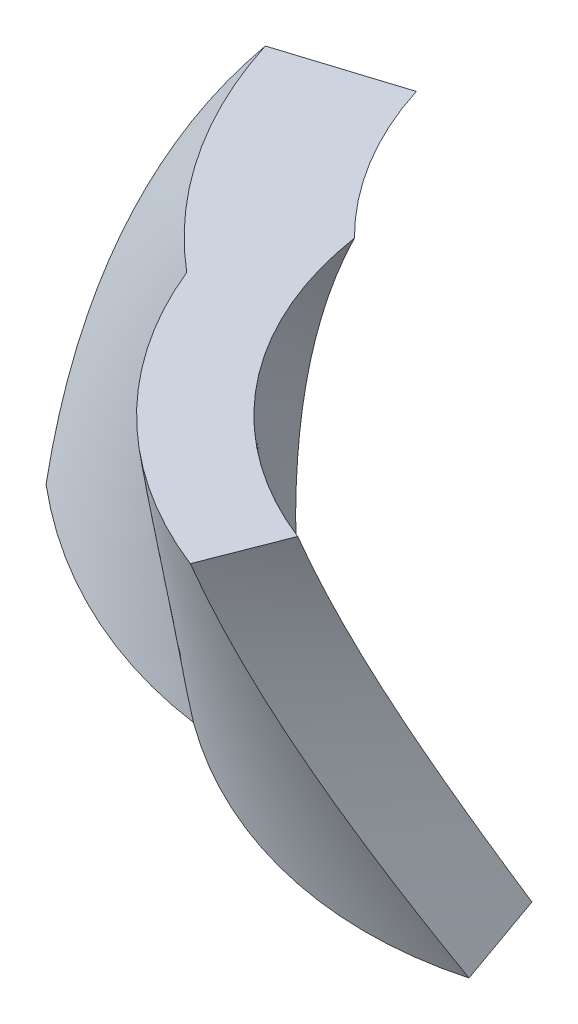
ISO-10303-21;
HEADER;
FILE_DESCRIPTION(('STEP AP214'),'2;1');
FILE_NAME('part.step','',(''),(''),'','','');
FILE_SCHEMA(('AUTOMOTIVE_DESIGN { 1 0 10303 214 1 1 1 1 }'));
ENDSEC;
DATA;
#1=APPLICATION_CONTEXT('core data for automotive mechanical design processes');
#2=APPLICATION_PROTOCOL_DEFINITION('international standard','automotive_design',2000,#1);
#3=PRODUCT_CONTEXT('',#1,'mechanical');
#4=PRODUCT('Part','Part','',(#3));
#5=PRODUCT_RELATED_PRODUCT_CATEGORY('part','',(#4));
#6=PRODUCT_DEFINITION_FORMATION('','',#4);
#7=PRODUCT_DEFINITION_CONTEXT('part definition',#1,'design');
#8=PRODUCT_DEFINITION('design','',#6,#7);
#9=PRODUCT_DEFINITION_SHAPE('','',#8);
#10=(LENGTH_UNIT() NAMED_UNIT(*) SI_UNIT(.MILLI.,.METRE.));
#11=(NAMED_UNIT(*) PLANE_ANGLE_UNIT() SI_UNIT($,.RADIAN.));
#12=(NAMED_UNIT(*) SI_UNIT($,.STERADIAN.) SOLID_ANGLE_UNIT());
#13=UNCERTAINTY_MEASURE_WITH_UNIT(LENGTH_MEASURE(1.E-05),#10,'distance_accuracy_value','');
#14=(GEOMETRIC_REPRESENTATION_CONTEXT(3) GLOBAL_UNCERTAINTY_ASSIGNED_CONTEXT((#13)) GLOBAL_UNIT_ASSIGNED_CONTEXT((#10,
#11,#12)) REPRESENTATION_CONTEXT('',''));
#15=CARTESIAN_POINT('',(0.,0.,0.));
#16=DIRECTION('',(0.,0.,1.));
#17=DIRECTION('',(1.,0.,0.));
#18=AXIS2_PLACEMENT_3D('',#15,#16,#17);
#19=CARTESIAN_POINT('',(41.3342929723728,93.832,53.4084346384661));
#20=DIRECTION('',(0.,1.,0.));
#21=DIRECTION('',(0.,0.,1.));
#22=AXIS2_PLACEMENT_3D('',#19,#20,#21);
#23=PLANE('',#22);
#24=CARTESIAN_POINT('',(41.3342929723728,93.832,53.4084346384661));
#25=DIRECTION('',(0.,1.,0.));
#26=DIRECTION('',(0.,0.,1.));
#27=AXIS2_PLACEMENT_3D('',#24,#25,#26);
#28=CIRCLE('',#27,131.06388012101);
#29=CARTESIAN_POINT('',(-80.0812314221427,93.832,102.764397888912));
#30=VERTEX_POINT('',#29);
#31=CARTESIAN_POINT('',(-6.27577924360031,93.832,175.519129075786));
#32=VERTEX_POINT('',#31);
#33=EDGE_CURVE('E103',#30,#32,#28,.T.);
#34=ORIENTED_EDGE('',*,*,#33,.T.);
#35=DIRECTION('',(0.363258528375743,0.,-0.931688382219232));
#36=VECTOR('',#35,1.);
#37=CARTESIAN_POINT('',(2.47983221247586,93.832,153.062666706335));
#38=LINE('',#37,#36);
#39=CARTESIAN_POINT('',(2.47983221247584,93.832,153.062666706335));
#40=VERTEX_POINT('',#39);
#41=EDGE_CURVE('E109',#32,#40,#38,.T.);
#42=ORIENTED_EDGE('',*,*,#41,.T.);
#43=CARTESIAN_POINT('',(41.3342929723728,93.832,53.4084346384661));
#44=DIRECTION('',(0.,-1.,0.));
#45=DIRECTION('',(0.,0.,1.));
#46=AXIS2_PLACEMENT_3D('',#43,#44,#45);
#47=CIRCLE('',#46,106.960904493086);
#48=CARTESIAN_POINT('',(-64.3749688172895,93.832,69.7236748102739));
#49=VERTEX_POINT('',#48);
#50=EDGE_CURVE('E120',#40,#49,#47,.T.);
#51=ORIENTED_EDGE('',*,*,#50,.T.);
#52=CARTESIAN_POINT('',(15.,93.832,-10.));
#53=DIRECTION('',(0.,-1.,0.));
#54=DIRECTION('',(0.,0.,1.));
#55=AXIS2_PLACEMENT_3D('',#52,#53,#54);
#56=CIRCLE('',#55,112.5);
#57=CARTESIAN_POINT('',(-92.3010759780632,93.832,23.8042762672104));
#58=VERTEX_POINT('',#57);
#59=EDGE_CURVE('E85',#49,#58,#56,.T.);
#60=ORIENTED_EDGE('',*,*,#59,.T.);
#61=DIRECTION('',(-0.953787342027229,0.,0.300482455708537));
#62=VECTOR('',#61,1.);
#63=CARTESIAN_POINT('',(-125.683632949016,93.832,34.3211622170093));
#64=LINE('',#63,#62);
#65=CARTESIAN_POINT('',(-125.683632949016,93.832,34.3211622170092));
#66=VERTEX_POINT('',#65);
#67=EDGE_CURVE('E80',#58,#66,#64,.T.);
#68=ORIENTED_EDGE('',*,*,#67,.T.);
#69=CARTESIAN_POINT('',(15.,93.832,-10.));
#70=DIRECTION('',(0.,1.,0.));
#71=DIRECTION('',(0.,0.,1.));
#72=AXIS2_PLACEMENT_3D('',#69,#70,#71);
#73=CIRCLE('',#72,147.5);
#74=EDGE_CURVE('E74',#66,#30,#73,.T.);
#75=ORIENTED_EDGE('',*,*,#74,.T.);
#76=EDGE_LOOP('',(#34,#42,#51,#60,#68,#75));
#77=FACE_BOUND('',#76,.T.);
#78=ADVANCED_FACE('F34',(#77),#23,.T.);
#79=CARTESIAN_POINT('',(-9.74418467257259,-0.121362156164928,-8.42507448204065));
#80=DIRECTION('',(-0.0188007977678443,0.974095213347374,0.225355375655931));
#81=DIRECTION('',(0.539589570529709,-0.179867394160963,0.822490617510807));
#82=AXIS2_PLACEMENT_3D('',#79,#80,#81);
#83=PLANE('',#82);
#84=CARTESIAN_POINT('',(-9.74418467257259,-0.121362156164928,-8.42507448204065));
#85=DIRECTION('',(-0.0188007977678443,0.974095213347374,0.225355375655931));
#86=DIRECTION('',(0.539589570529709,-0.179867394160963,0.822490617510807));
#87=AXIS2_PLACEMENT_3D('',#84,#85,#86);
#88=CIRCLE('',#87,131.06388012101);
#89=CARTESIAN_POINT('',(-85.3098853126717,-25.6404533327942,95.5765675466524));
#90=VERTEX_POINT('',#89);
#91=CARTESIAN_POINT('',(16.0712054604024,-28.6106686611302,116.873232447954));
#92=VERTEX_POINT('',#91);
#93=EDGE_CURVE('E114',#90,#92,#88,.T.);
#94=ORIENTED_EDGE('',*,*,#93,.F.);
#95=CARTESIAN_POINT('',(-66.1247698860921,7.6742934456919,-46.8253600848027));
#96=DIRECTION('',(-0.0188007977678443,0.974095213347374,0.225355375655931));
#97=DIRECTION('',(0.539589570529709,-0.179867394160963,0.822490617510807));
#98=AXIS2_PLACEMENT_3D('',#95,#96,#97);
#99=CIRCLE('',#98,147.5);
#100=CARTESIAN_POINT('',(-160.625515415576,-19.580143834801,63.0975890336381));
#101=VERTEX_POINT('',#100);
#102=EDGE_CURVE('E11',#101,#90,#99,.T.);
#103=ORIENTED_EDGE('',*,*,#102,.F.);
#104=DIRECTION('',(-0.640683020538877,-0.184775845969443,0.745240333006378));
#105=VECTOR('',#104,1.);
#106=CARTESIAN_POINT('',(-160.625515415576,-19.580143834801,63.0975890336381));
#107=LINE('',#106,#105);
#108=CARTESIAN_POINT('',(-138.201609696716,-13.1129892258704,37.0141773784148));
#109=VERTEX_POINT('',#108);
#110=EDGE_CURVE('E52',#109,#101,#107,.T.);
#111=ORIENTED_EDGE('',*,*,#110,.F.);
#112=CARTESIAN_POINT('',(-66.1247698860921,7.6742934456919,-46.8253600848027));
#113=DIRECTION('',(0.0188007977678443,-0.974095213347374,-0.225355375655931));
#114=DIRECTION('',(0.539589570529709,-0.179867394160963,0.822490617510807));
#115=AXIS2_PLACEMENT_3D('',#112,#113,#114);
#116=CIRCLE('',#115,112.5);
#117=CARTESIAN_POINT('',(-89.9180668936186,-17.544758825644,60.1986018118083));
#118=VERTEX_POINT('',#117);
#119=EDGE_CURVE('E61',#118,#109,#116,.T.);
#120=ORIENTED_EDGE('',*,*,#119,.F.);
#121=CARTESIAN_POINT('',(-9.74418467257259,-0.121362156164928,-8.42507448204065));
#122=DIRECTION('',(0.0188007977678443,-0.974095213347374,-0.225355375655931));
#123=DIRECTION('',(0.539589570529709,-0.179867394160963,0.822490617510807));
#124=AXIS2_PLACEMENT_3D('',#121,#122,#123);
#125=CIRCLE('',#124,106.960904493086);
#126=CARTESIAN_POINT('',(11.3236905949342,-23.3714138816163,93.8305601620011));
#127=VERTEX_POINT('',#126);
#128=EDGE_CURVE('E127',#127,#118,#125,.T.);
#129=ORIENTED_EDGE('',*,*,#128,.F.);
#130=DIRECTION('',(-0.196967998422906,0.21736962524428,-0.956009442222427));
#131=VECTOR('',#130,1.);
#132=CARTESIAN_POINT('',(11.3236905949342,-23.3714138816163,93.8305601620011));
#133=LINE('',#132,#131);
#134=EDGE_CURVE('E117',#92,#127,#133,.T.);
#135=ORIENTED_EDGE('',*,*,#134,.F.);
#136=EDGE_LOOP('',(#94,#103,#111,#120,#129,#135));
#137=FACE_BOUND('',#136,.T.);
#138=ADVANCED_FACE('F168',(#137),#83,.F.);
#139=CARTESIAN_POINT('',(-80.0812314221427,93.832,102.764397888912));
#140=CARTESIAN_POINT('',(-87.9049809500753,74.1874804232091,100.244649936825));
#141=CARTESIAN_POINT('',(-92.2598196728068,54.4100251886731,98.398890007349));
#142=CARTESIAN_POINT('',(-94.0085283136072,14.5860679510201,96.0167673748026));
#143=CARTESIAN_POINT('',(-91.4023823388039,-5.46030694273945,95.4802751852545));
#144=CARTESIAN_POINT('',(-85.3098853126717,-25.6404533327942,95.5765675466524));
#145=CARTESIAN_POINT('',(-66.3249145462816,93.832,136.604896933467));
#146=CARTESIAN_POINT('',(-70.9596277929074,73.1607068772512,132.788783178619));
#147=CARTESIAN_POINT('',(-72.2890692067964,52.4938375110587,129.136777504654));
#148=CARTESIAN_POINT('',(-68.5926410546356,11.2474260198911,122.288549233658));
#149=CARTESIAN_POINT('',(-63.5672700005796,-9.33245703140339,119.09276782907));
#150=CARTESIAN_POINT('',(-55.4709618933182,-29.8417751644605,116.226099590123));
#151=CARTESIAN_POINT('',(-40.3100335866361,93.832,162.24942068083));
#152=CARTESIAN_POINT('',(-42.5280777395167,72.5982060404491,155.981701037));
#153=CARTESIAN_POINT('',(-41.7786424345171,51.5528970365655,149.503686193732));
#154=CARTESIAN_POINT('',(-34.7913396827833,9.95202027561961,136.514456229337));
#155=CARTESIAN_POINT('',(-28.554138088647,-10.6043905641166,130.004302753976));
#156=CARTESIAN_POINT('',(-19.7362440618987,-30.8887140546153,123.732729329408));
#157=CARTESIAN_POINT('',(-6.27577924360034,93.832,175.519129075786));
#158=CARTESIAN_POINT('',(-7.2433178348224,72.5916618630772,166.0440401816));
#159=CARTESIAN_POINT('',(-5.70029062575824,51.74053239737,156.180776751773));
#160=CARTESIAN_POINT('',(1.88736818689984,10.9109403629436,136.376340808609));
#161=CARTESIAN_POINT('',(7.93143961227243,-9.06888506634479,126.436808077582));
#162=CARTESIAN_POINT('',(16.0712054604024,-28.6106686611302,116.873232447954));
#163=(BOUNDED_SURFACE() B_SPLINE_SURFACE(3,3,((#139,#140,#141,#142,#143,#144),(#145,#146,#147,
#148,#149,#150),(#151,#152,#153,#154,#155,#156),(#157,#158,#159,#160,#161,#162)),.UNSPECIFIED.,
.F.,.F.,.F.) B_SPLINE_SURFACE_WITH_KNOTS((4,4),(4,2,4),(0.,1.),(0.,0.5,1.),
.UNSPECIFIED.) GEOMETRIC_REPRESENTATION_ITEM() RATIONAL_B_SPLINE_SURFACE(((1.,1.,1.,1.,1.,1.),
(0.945682489610852,0.945682489610852,0.945682489610852,0.945682489610852,0.945682489610852,
0.945682489610852),(0.945682489610852,0.945682489610852,0.945682489610852,0.945682489610852,
0.945682489610852,0.945682489610852),(1.,1.,1.,1.,1.,1.))) REPRESENTATION_ITEM('') SURFACE());
#164=CARTESIAN_POINT('',(-6.27577924360034,93.832,175.519129075786));
#165=CARTESIAN_POINT('',(-7.2433178348224,72.5916618630772,166.0440401816));
#166=CARTESIAN_POINT('',(-5.70029062575824,51.74053239737,156.180776751773));
#167=CARTESIAN_POINT('',(1.88736818689984,10.9109403629436,136.376340808609));
#168=CARTESIAN_POINT('',(7.93143961227243,-9.06888506634479,126.436808077582));
#169=CARTESIAN_POINT('',(16.0712054604024,-28.6106686611302,116.873232447954));
#170=B_SPLINE_CURVE_WITH_KNOTS('',3,(#164,#165,#166,#167,#168,#169),.UNSPECIFIED.,.F.,.F.,(4,2,
4),(0.,0.5,1.),.UNSPECIFIED.);
#171=EDGE_CURVE('E106',#32,#92,#170,.T.);
#172=CARTESIAN_POINT('',(-80.0812314221427,93.832,102.764397888912));
#173=CARTESIAN_POINT('',(-87.9049809500753,74.1874804232091,100.244649936825));
#174=CARTESIAN_POINT('',(-92.2598196728068,54.4100251886731,98.398890007349));
#175=CARTESIAN_POINT('',(-94.0085283136072,14.5860679510201,96.0167673748026));
#176=CARTESIAN_POINT('',(-91.4023823388039,-5.46030694273945,95.4802751852545));
#177=CARTESIAN_POINT('',(-85.3098853126717,-25.6404533327942,95.5765675466524));
#178=B_SPLINE_CURVE_WITH_KNOTS('',3,(#172,#173,#174,#175,#176,#177),.UNSPECIFIED.,.F.,.F.,(4,2,
4),(0.,0.5,1.),.UNSPECIFIED.);
#179=EDGE_CURVE('E37',#30,#90,#178,.T.);
#180=ORIENTED_EDGE('',*,*,#171,.F.);
#181=ORIENTED_EDGE('',*,*,#33,.F.);
#182=ORIENTED_EDGE('',*,*,#179,.T.);
#183=ORIENTED_EDGE('',*,*,#93,.T.);
#184=EDGE_LOOP('',(#180,#181,#182,#183));
#185=FACE_BOUND('',#184,.T.);
#186=ADVANCED_FACE('F104',(#185),#163,.F.);
#187=CARTESIAN_POINT('',(-6.27577924360029,93.832,175.519129075786));
#188=CARTESIAN_POINT('',(-7.24331783482668,72.5916618629823,166.044040181557));
#189=CARTESIAN_POINT('',(-5.7002906258358,51.7405323975253,156.180776751773));
#190=CARTESIAN_POINT('',(1.88736818697753,10.9109403627883,136.376340808609));
#191=CARTESIAN_POINT('',(7.9314396125846,-9.06888506652775,126.43680807851));
#192=CARTESIAN_POINT('',(16.0712054604025,-28.6106686611302,116.873232447954));
#193=CARTESIAN_POINT('',(2.47983221247586,93.832,153.062666706335));
#194=CARTESIAN_POINT('',(-0.603964863018619,73.5204396995985,142.762477080619));
#195=CARTESIAN_POINT('',(-1.3138051292794,53.5984801043479,132.426155360869));
#196=CARTESIAN_POINT('',(1.70205931934622,14.5427584243263,112.423244551083));
#197=CARTESIAN_POINT('',(5.4277296968098,-4.5927423040578,102.758304083365));
#198=CARTESIAN_POINT('',(11.3236905949342,-23.3714138816163,93.8305601620011));
#199=B_SPLINE_SURFACE_WITH_KNOTS('',1,3,((#187,#188,#189,#190,#191,#192),(#193,#194,#195,#196,
#197,#198)),.UNSPECIFIED.,.F.,.F.,.F.,(2,2),(4,2,4),(0.,1.),(0.,0.5,1.),.UNSPECIFIED.);
#200=CARTESIAN_POINT('',(2.47983221247586,93.832,153.062666706335));
#201=CARTESIAN_POINT('',(-0.603964863018619,73.5204396995985,142.762477080619));
#202=CARTESIAN_POINT('',(-1.3138051292794,53.5984801043479,132.426155360869));
#203=CARTESIAN_POINT('',(1.70205931934622,14.5427584243263,112.423244551083));
#204=CARTESIAN_POINT('',(5.4277296968098,-4.5927423040578,102.758304083365));
#205=CARTESIAN_POINT('',(11.3236905949342,-23.3714138816163,93.8305601620011));
#206=B_SPLINE_CURVE_WITH_KNOTS('',3,(#200,#201,#202,#203,#204,#205),.UNSPECIFIED.,.F.,.F.,(4,2,
4),(0.,0.5,1.),.UNSPECIFIED.);
#207=EDGE_CURVE('E122',#40,#127,#206,.T.);
#208=ORIENTED_EDGE('',*,*,#207,.F.);
#209=ORIENTED_EDGE('',*,*,#41,.F.);
#210=ORIENTED_EDGE('',*,*,#171,.T.);
#211=ORIENTED_EDGE('',*,*,#134,.T.);
#212=EDGE_LOOP('',(#208,#209,#210,#211));
#213=FACE_BOUND('',#212,.T.);
#214=ADVANCED_FACE('F200',(#213),#199,.F.);
#215=CARTESIAN_POINT('',(2.47983221247582,93.832,153.062666706335));
#216=CARTESIAN_POINT('',(-0.603964863005879,73.5204396996827,142.762477080662));
#217=CARTESIAN_POINT('',(-1.31380512920183,53.5984801041926,132.426155360869));
#218=CARTESIAN_POINT('',(1.70205931926854,14.5427584244815,112.423244551083));
#219=CARTESIAN_POINT('',(5.42772969744441,-4.59274230388589,102.758304083139));
#220=CARTESIAN_POINT('',(11.3236905949341,-23.3714138816163,93.8305601620011));
#221=CARTESIAN_POINT('',(-33.9465440387311,93.832,138.8602873662));
#222=CARTESIAN_POINT('',(-38.3687240636721,73.5274433150249,131.992899245469));
#223=CARTESIAN_POINT('',(-39.9279496984614,53.3976566579929,125.279760717288));
#224=CARTESIAN_POINT('',(-37.5546377660578,13.5164399528521,112.571067513078));
#225=CARTESIAN_POINT('',(-33.6222225857992,-6.23610189851179,106.576570808041));
#226=CARTESIAN_POINT('',(-27.0005111269213,-25.8095733248655,101.172181687755));
#227=CARTESIAN_POINT('',(-58.4112975833139,93.832,108.363331785054));
#228=CARTESIAN_POINT('',(-65.7074205593238,74.2858746972417,103.801462477876));
#229=CARTESIAN_POINT('',(-69.8276503967437,54.7288591352585,99.8440708536068));
#230=CARTESIAN_POINT('',(-71.7147773568309,15.5695471977918,93.293927308564));
#231=CARTESIAN_POINT('',(-69.4814886076579,-4.03323120492211,90.7016135171579));
#232=CARTESIAN_POINT('',(-64.0487800205063,-23.6773752218423,88.8649493037594));
#233=CARTESIAN_POINT('',(-64.3749688172895,93.832,69.7236748102739));
#234=CARTESIAN_POINT('',(-75.3124152114103,75.5929807761699,65.7238001204291));
#235=CARTESIAN_POINT('',(-83.0206793629674,57.2362554281702,62.9180778819271));
#236=CARTESIAN_POINT('',(-91.6473108811818,20.1532819925745,59.7446279258126));
#237=CARTESIAN_POINT('',(-92.5646647008839,1.42708570289805,59.3768762490464));
#238=CARTESIAN_POINT('',(-89.9180668936186,-17.544758825644,60.1986018118083));
#239=(BOUNDED_SURFACE() B_SPLINE_SURFACE(3,3,((#215,#216,#217,#218,#219,#220),(#221,#222,#223,
#224,#225,#226),(#227,#228,#229,#230,#231,#232),(#233,#234,#235,#236,#237,#238)),.UNSPECIFIED.,
.F.,.F.,.F.) B_SPLINE_SURFACE_WITH_KNOTS((4,4),(4,2,4),(0.,1.),(0.,0.5,1.),
.UNSPECIFIED.) GEOMETRIC_REPRESENTATION_ITEM() RATIONAL_B_SPLINE_SURFACE(((1.,1.,1.,1.,1.,1.),
(0.910899577875491,0.910899577875491,0.910899577875491,0.910899577875491,0.910899577875491,
0.910899577875491),(0.910899577875491,0.910899577875491,0.910899577875491,0.910899577875491,
0.910899577875491,0.910899577875491),(1.,1.,1.,1.,1.,1.))) REPRESENTATION_ITEM('') SURFACE());
#240=CARTESIAN_POINT('',(-64.3749688172895,93.832,69.7236748102739));
#241=CARTESIAN_POINT('',(-75.3124152114103,75.5929807761699,65.7238001204291));
#242=CARTESIAN_POINT('',(-83.0206793629674,57.2362554281702,62.9180778819271));
#243=CARTESIAN_POINT('',(-91.6473108811818,20.1532819925745,59.7446279258126));
#244=CARTESIAN_POINT('',(-92.5646647008839,1.42708570289805,59.3768762490464));
#245=CARTESIAN_POINT('',(-89.9180668936186,-17.544758825644,60.1986018118083));
#246=B_SPLINE_CURVE_WITH_KNOTS('',3,(#240,#241,#242,#243,#244,#245),.UNSPECIFIED.,.F.,.F.,(4,2,
4),(0.,0.5,1.),.UNSPECIFIED.);
#247=EDGE_CURVE('E133',#49,#118,#246,.T.);
#248=ORIENTED_EDGE('',*,*,#247,.F.);
#249=ORIENTED_EDGE('',*,*,#50,.F.);
#250=ORIENTED_EDGE('',*,*,#207,.T.);
#251=ORIENTED_EDGE('',*,*,#128,.T.);
#252=EDGE_LOOP('',(#248,#249,#250,#251));
#253=FACE_BOUND('',#252,.T.);
#254=ADVANCED_FACE('F164',(#253),#239,.F.);
#255=CARTESIAN_POINT('',(-64.3749688172894,93.832,69.7236748102739));
#256=CARTESIAN_POINT('',(-75.3124152114103,75.5929807761699,65.7238001204291));
#257=CARTESIAN_POINT('',(-83.0206793629674,57.2362554281702,62.9180778819271));
#258=CARTESIAN_POINT('',(-91.6473108811818,20.1532819925745,59.7446279258126));
#259=CARTESIAN_POINT('',(-92.5646647004077,1.42708570296436,59.3768762490435));
#260=CARTESIAN_POINT('',(-89.9180668936186,-17.544758825644,60.1986018118082));
#261=CARTESIAN_POINT('',(-77.3201916717664,93.832,56.835073490123));
#262=CARTESIAN_POINT('',(-89.4722451650738,75.8774109844569,54.0551227975715));
#263=CARTESIAN_POINT('',(-98.2270806119901,57.7134061793001,52.6576254757442));
#264=CARTESIAN_POINT('',(-108.514603253533,20.8145925933296,52.5476624759678));
#265=CARTESIAN_POINT('',(-110.046074251063,2.08036333020764,53.8346245030512));
#266=CARTESIAN_POINT('',(-107.768852171552,-17.0008293496531,56.3582314614228));
#267=CARTESIAN_POINT('',(-86.8120679668952,93.832,41.2274111686913));
#268=CARTESIAN_POINT('',(-100.434984797107,76.307382203153,39.3419494287662));
#269=CARTESIAN_POINT('',(-110.541973139727,58.4939858446735,39.0717022887552));
#270=CARTESIAN_POINT('',(-123.17219804541,22.1051734621293,41.5780450091161));
#271=CARTESIAN_POINT('',(-125.693846491467,3.53081487602168,44.35349544279));
#272=CARTESIAN_POINT('',(-124.180069558174,-15.4945037967435,48.4780178882026));
#273=CARTESIAN_POINT('',(-92.3010759780632,93.832,23.8042762672104));
#274=CARTESIAN_POINT('',(-107.565961442551,76.8580069344687,22.4360834429845));
#275=CARTESIAN_POINT('',(-119.252399805947,59.5328036241931,22.9468503811813));
#276=CARTESIAN_POINT('',(-134.771509948732,23.9503078409335,27.4708494479388));
#277=CARTESIAN_POINT('',(-138.602044831498,5.69446592980166,31.4824041895498));
#278=CARTESIAN_POINT('',(-138.201609696716,-13.1129892258704,37.0141773784148));
#279=(BOUNDED_SURFACE() B_SPLINE_SURFACE(3,3,((#255,#256,#257,#258,#259,#260),(#261,#262,#263,
#264,#265,#266),(#267,#268,#269,#270,#271,#272),(#273,#274,#275,#276,#277,#278)),.UNSPECIFIED.,
.F.,.F.,.F.) B_SPLINE_SURFACE_WITH_KNOTS((4,4),(4,2,4),(0.,1.),(0.,0.5,1.),
.UNSPECIFIED.) GEOMETRIC_REPRESENTATION_ITEM() RATIONAL_B_SPLINE_SURFACE(((1.,1.,1.,1.,1.,1.),
(0.980702033769849,0.980702033769849,0.980702033769849,0.980702033769849,0.980702033769849,
0.980702033769849),(0.980702033769849,0.980702033769849,0.980702033769849,0.980702033769849,
0.980702033769849,0.980702033769849),(1.,1.,1.,1.,1.,1.))) REPRESENTATION_ITEM('') SURFACE());
#280=CARTESIAN_POINT('',(-92.3010759780632,93.832,23.8042762672104));
#281=CARTESIAN_POINT('',(-107.565961442551,76.8580069344687,22.4360834429845));
#282=CARTESIAN_POINT('',(-119.252399805947,59.5328036241931,22.9468503811813));
#283=CARTESIAN_POINT('',(-134.771509948732,23.9503078409335,27.4708494479388));
#284=CARTESIAN_POINT('',(-138.602044831498,5.69446592980166,31.4824041895498));
#285=CARTESIAN_POINT('',(-138.201609696716,-13.1129892258704,37.0141773784148));
#286=B_SPLINE_CURVE_WITH_KNOTS('',3,(#280,#281,#282,#283,#284,#285),.UNSPECIFIED.,.F.,.F.,(4,2,
4),(0.,0.5,1.),.UNSPECIFIED.);
#287=EDGE_CURVE('E136',#58,#109,#286,.T.);
#288=ORIENTED_EDGE('',*,*,#287,.F.);
#289=ORIENTED_EDGE('',*,*,#59,.F.);
#290=ORIENTED_EDGE('',*,*,#247,.T.);
#291=ORIENTED_EDGE('',*,*,#119,.T.);
#292=EDGE_LOOP('',(#288,#289,#290,#291));
#293=FACE_BOUND('',#292,.T.);
#294=ADVANCED_FACE('F162',(#293),#279,.F.);
#295=CARTESIAN_POINT('',(-92.3010759780632,93.832,23.8042762672104));
#296=CARTESIAN_POINT('',(-107.565961442611,76.8580069344019,22.4360834429791));
#297=CARTESIAN_POINT('',(-119.252399805947,59.5328036243483,22.9468503812589));
#298=CARTESIAN_POINT('',(-134.771509948732,23.9503078407782,27.4708494478612));
#299=CARTESIAN_POINT('',(-138.602044830533,5.69446592989917,31.4824041894735));
#300=CARTESIAN_POINT('',(-138.201609696716,-13.1129892258704,37.0141773784147));
#301=CARTESIAN_POINT('',(-125.683632949016,93.832,34.3211622170093));
#302=CARTESIAN_POINT('',(-139.957426960281,76.0179865015196,36.0988848296448));
#303=CARTESIAN_POINT('',(-150.187250967596,57.7026120884524,39.5682178556441));
#304=CARTESIAN_POINT('',(-161.996057374954,19.9305121873513,49.3626226631409));
#305=CARTESIAN_POINT('',(-163.573723298194,0.475815604661499,55.68499018563));
#306=CARTESIAN_POINT('',(-160.625515415576,-19.580143834801,63.0975890336381));
#307=B_SPLINE_SURFACE_WITH_KNOTS('',1,3,((#295,#296,#297,#298,#299,#300),(#301,#302,#303,#304,
#305,#306)),.UNSPECIFIED.,.F.,.F.,.F.,(2,2),(4,2,4),(0.,1.),(0.,0.5,1.),.UNSPECIFIED.);
#308=CARTESIAN_POINT('',(-125.683632949016,93.832,34.3211622170093));
#309=CARTESIAN_POINT('',(-139.957426960281,76.0179865015196,36.0988848296448));
#310=CARTESIAN_POINT('',(-150.187250967596,57.7026120884524,39.5682178556441));
#311=CARTESIAN_POINT('',(-161.996057374954,19.9305121873513,49.3626226631409));
#312=CARTESIAN_POINT('',(-163.573723298194,0.475815604661499,55.68499018563));
#313=CARTESIAN_POINT('',(-160.625515415576,-19.580143834801,63.0975890336381));
#314=B_SPLINE_CURVE_WITH_KNOTS('',3,(#308,#309,#310,#311,#312,#313),.UNSPECIFIED.,.F.,.F.,(4,2,
4),(0.,0.5,1.),.UNSPECIFIED.);
#315=EDGE_CURVE('E44',#66,#101,#314,.T.);
#316=ORIENTED_EDGE('',*,*,#315,.F.);
#317=ORIENTED_EDGE('',*,*,#67,.F.);
#318=ORIENTED_EDGE('',*,*,#287,.T.);
#319=ORIENTED_EDGE('',*,*,#110,.T.);
#320=EDGE_LOOP('',(#316,#317,#318,#319));
#321=FACE_BOUND('',#320,.T.);
#322=ADVANCED_FACE('F169',(#321),#307,.F.);
#323=CARTESIAN_POINT('',(-125.683632949016,93.832,34.3211622170092));
#324=CARTESIAN_POINT('',(-139.957426960383,76.0179865013925,36.0988848296574));
#325=CARTESIAN_POINT('',(-150.187250967286,57.7026120884524,39.5682178553336));
#326=CARTESIAN_POINT('',(-161.996057375265,19.9305121873513,49.3626226634514));
#327=CARTESIAN_POINT('',(-163.573723300407,0.475815604138737,55.6849901849542));
#328=CARTESIAN_POINT('',(-160.625515415576,-19.580143834801,63.0975890336381));
#329=CARTESIAN_POINT('',(-117.222366477456,93.832,61.178799675623));
#330=CARTESIAN_POINT('',(-128.965091059195,75.1692000808886,62.1591425971154));
#331=CARTESIAN_POINT('',(-136.760190749762,56.1012819336834,64.4245613924235));
#332=CARTESIAN_POINT('',(-144.115801288096,17.0862507792801,71.1087634174238));
#333=CARTESIAN_POINT('',(-143.675747144867,-2.85935091686063,75.525706970333));
#334=CARTESIAN_POINT('',(-139.011411881296,-23.2512314610283,80.7690169389046));
#335=CARTESIAN_POINT('',(-101.608862271972,93.832,84.6126257948556));
#336=CARTESIAN_POINT('',(-111.143202070945,74.5424692338711,84.1215865006742));
#337=CARTESIAN_POINT('',(-116.926801238355,54.9739549138466,84.5672055582321));
#338=CARTESIAN_POINT('',(-120.838001536909,15.2564019168975,87.0823670053722));
#339=CARTESIAN_POINT('',(-118.965460102218,-4.89178037641244,89.1509605789488));
#340=CARTESIAN_POINT('',(-113.22459215301,-25.326180688816,91.8892792633335));
#341=CARTESIAN_POINT('',(-80.0812314221427,93.832,102.764397888912));
#342=CARTESIAN_POINT('',(-87.9049809500516,74.1874804232688,100.244649936833));
#343=CARTESIAN_POINT('',(-92.2598196726516,54.4100251885178,98.398890007349));
#344=CARTESIAN_POINT('',(-94.0085283137625,14.5860679511754,96.0167673748026));
#345=CARTESIAN_POINT('',(-91.4023823393847,-5.46030694307123,95.480275184282));
#346=CARTESIAN_POINT('',(-85.3098853126718,-25.6404533327942,95.5765675466524));
#347=(BOUNDED_SURFACE() B_SPLINE_SURFACE(3,3,((#323,#324,#325,#326,#327,#328),(#329,#330,#331,
#332,#333,#334),(#335,#336,#337,#338,#339,#340),(#341,#342,#343,#344,#345,#346)),.UNSPECIFIED.,
.F.,.F.,.F.) B_SPLINE_SURFACE_WITH_KNOTS((4,4),(4,2,4),(0.,1.),(0.,0.5,1.),
.UNSPECIFIED.) GEOMETRIC_REPRESENTATION_ITEM() RATIONAL_B_SPLINE_SURFACE(((1.,1.,1.,1.,1.,1.),
(0.973567516228608,0.973567516228608,0.973567516228608,0.973567516228608,0.973567516228608,
0.973567516228608),(0.973567516228608,0.973567516228608,0.973567516228608,0.973567516228608,
0.973567516228608,0.973567516228608),(1.,1.,1.,1.,1.,1.))) REPRESENTATION_ITEM('') SURFACE());
#348=ORIENTED_EDGE('',*,*,#102,.T.);
#349=ORIENTED_EDGE('',*,*,#179,.F.);
#350=ORIENTED_EDGE('',*,*,#74,.F.);
#351=ORIENTED_EDGE('',*,*,#315,.T.);
#352=EDGE_LOOP('',(#348,#349,#350,#351));
#353=FACE_BOUND('',#352,.T.);
#354=ADVANCED_FACE('F112',(#353),#347,.F.);
#355=CLOSED_SHELL('',(#78,#138,#186,#214,#254,#294,#322,#354));
#356=MANIFOLD_SOLID_BREP('B2',#355);
#357=ADVANCED_BREP_SHAPE_REPRESENTATION('',(#18,#356),#14);
#358=SHAPE_DEFINITION_REPRESENTATION(#9,#357);
ENDSEC;
END-ISO-10303-21;
